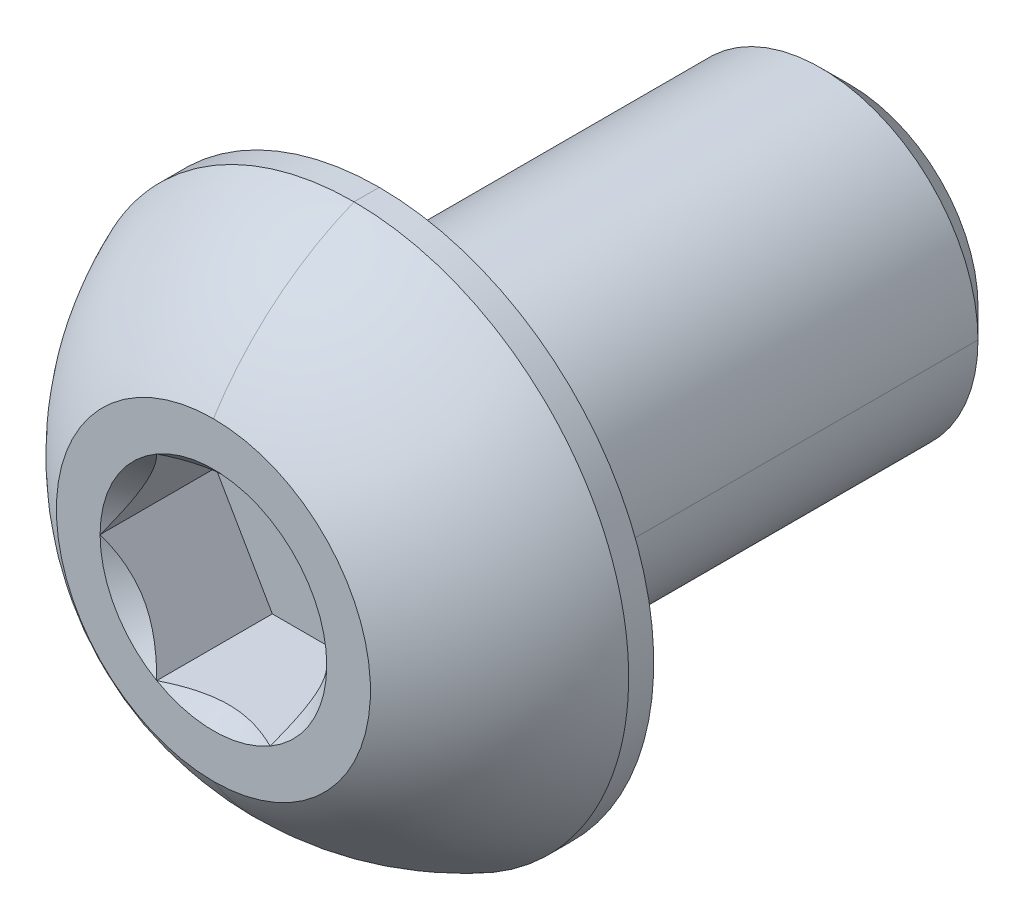
ISO-10303-21;
HEADER;
FILE_DESCRIPTION(('STEP AP214'),'2;1');
FILE_NAME('part.step','',(''),(''),'','','');
FILE_SCHEMA(('AUTOMOTIVE_DESIGN { 1 0 10303 214 1 1 1 1 }'));
ENDSEC;
DATA;
#1=APPLICATION_CONTEXT('core data for automotive mechanical design processes');
#2=APPLICATION_PROTOCOL_DEFINITION('international standard','automotive_design',2000,#1);
#3=PRODUCT_CONTEXT('',#1,'mechanical');
#4=PRODUCT('Part','Part','',(#3));
#5=PRODUCT_RELATED_PRODUCT_CATEGORY('part','',(#4));
#6=PRODUCT_DEFINITION_FORMATION('','',#4);
#7=PRODUCT_DEFINITION_CONTEXT('part definition',#1,'design');
#8=PRODUCT_DEFINITION('design','',#6,#7);
#9=PRODUCT_DEFINITION_SHAPE('','',#8);
#10=(LENGTH_UNIT() NAMED_UNIT(*) SI_UNIT(.MILLI.,.METRE.));
#11=(NAMED_UNIT(*) PLANE_ANGLE_UNIT() SI_UNIT($,.RADIAN.));
#12=(NAMED_UNIT(*) SI_UNIT($,.STERADIAN.) SOLID_ANGLE_UNIT());
#13=UNCERTAINTY_MEASURE_WITH_UNIT(LENGTH_MEASURE(1.E-05),#10,'distance_accuracy_value','');
#14=(GEOMETRIC_REPRESENTATION_CONTEXT(3) GLOBAL_UNCERTAINTY_ASSIGNED_CONTEXT((#13)) GLOBAL_UNIT_ASSIGNED_CONTEXT((#10,
#11,#12)) REPRESENTATION_CONTEXT('',''));
#15=CARTESIAN_POINT('',(0.,0.,0.));
#16=DIRECTION('',(0.,0.,1.));
#17=DIRECTION('',(1.,0.,0.));
#18=AXIS2_PLACEMENT_3D('',#15,#16,#17);
#19=CARTESIAN_POINT('',(1.14567944042316,-1.98437500000003,10.541));
#20=DIRECTION('',(0.866025403784439,-0.5,0.));
#21=DIRECTION('',(0.,0.,-1.));
#22=AXIS2_PLACEMENT_3D('',#19,#20,#21);
#23=PLANE('',#22);
#24=DIRECTION('',(0.,0.,1.));
#25=VECTOR('',#24,1.);
#26=CARTESIAN_POINT('',(1.14567944042316,-1.98437500000003,10.541));
#27=LINE('',#26,#25);
#28=CARTESIAN_POINT('',(1.14567944042316,-1.98437500000003,10.541));
#29=VERTEX_POINT('',#28);
#30=CARTESIAN_POINT('',(1.14567944042305,-1.98437500000003,12.8778));
#31=VERTEX_POINT('',#30);
#32=EDGE_CURVE('E11',#29,#31,#27,.T.);
#33=ORIENTED_EDGE('',*,*,#32,.T.);
#34=CARTESIAN_POINT('',(1.14567944042313,-1.98437500000008,12.8778));
#35=CARTESIAN_POINT('',(1.29042438712971,-1.73366939816544,12.7330550532936));
#36=CARTESIAN_POINT('',(1.42153475258447,-1.50657958379887,12.6578037371241));
#37=CARTESIAN_POINT('',(1.57187260585666,-1.2461867836306,12.571516727782));
#38=CARTESIAN_POINT('',(1.71640935887327,-0.995841783844794,12.5708206054614));
#39=CARTESIAN_POINT('',(1.86068359960209,-0.745951468679066,12.5701257474604));
#40=CARTESIAN_POINT('',(2.01166904881077,-0.484436999446014,12.6556176627032));
#41=CARTESIAN_POINT('',(2.14424389094126,-0.254810637070578,12.7306850100943));
#42=CARTESIAN_POINT('',(2.29135888084634,0.,12.8778));
#43=B_SPLINE_CURVE_WITH_KNOTS('',2,(#34,#35,#36,#37,#38,#39,#40,#41,#42),.UNSPECIFIED.,.F.,.F.,
(3,2,2,2,3),(0.,0.25,0.5,0.75,1.),.UNSPECIFIED.);
#44=CARTESIAN_POINT('',(2.2913588808463,0.,12.8778));
#45=VERTEX_POINT('',#44);
#46=EDGE_CURVE('E244',#31,#45,#43,.T.);
#47=ORIENTED_EDGE('',*,*,#46,.T.);
#48=DIRECTION('',(0.,0.,1.));
#49=VECTOR('',#48,1.);
#50=CARTESIAN_POINT('',(2.29135888084632,0.,10.541));
#51=LINE('',#50,#49);
#52=CARTESIAN_POINT('',(2.29135888084632,0.,10.541));
#53=VERTEX_POINT('',#52);
#54=EDGE_CURVE('E399',#53,#45,#51,.T.);
#55=ORIENTED_EDGE('',*,*,#54,.F.);
#56=DIRECTION('',(0.5,0.866025403784439,0.));
#57=VECTOR('',#56,1.);
#58=CARTESIAN_POINT('',(1.14567944042316,-1.98437500000003,10.541));
#59=LINE('',#58,#57);
#60=EDGE_CURVE('E370',#29,#53,#59,.T.);
#61=ORIENTED_EDGE('',*,*,#60,.F.);
#62=EDGE_LOOP('',(#33,#47,#55,#61));
#63=FACE_BOUND('',#62,.T.);
#64=ADVANCED_FACE('F16',(#63),#23,.F.);
#65=CARTESIAN_POINT('',(-1.14567944042316,-1.98437500000003,10.541));
#66=DIRECTION('',(0.,-1.,0.));
#67=DIRECTION('',(0.,0.,-1.));
#68=AXIS2_PLACEMENT_3D('',#65,#66,#67);
#69=PLANE('',#68);
#70=DIRECTION('',(0.,0.,1.));
#71=VECTOR('',#70,1.);
#72=CARTESIAN_POINT('',(-1.14567944042316,-1.98437500000003,10.541));
#73=LINE('',#72,#71);
#74=CARTESIAN_POINT('',(-1.14567944042316,-1.98437500000003,10.541));
#75=VERTEX_POINT('',#74);
#76=CARTESIAN_POINT('',(-1.14567944042316,-1.98437500000003,12.8778));
#77=VERTEX_POINT('',#76);
#78=EDGE_CURVE('E30',#75,#77,#73,.T.);
#79=ORIENTED_EDGE('',*,*,#78,.T.);
#80=CARTESIAN_POINT('',(-1.14567944042316,-1.98437500000003,12.8778));
#81=CARTESIAN_POINT('',(-0.853920501298432,-1.98437500000003,12.7319205304377));
#82=CARTESIAN_POINT('',(-0.589781630516632,-1.98437500000003,12.6566069367442));
#83=CARTESIAN_POINT('',(-0.289117956224624,-1.98437500000003,12.5708790704251));
#84=CARTESIAN_POINT('',(0.000124911504018098,-1.98437500000003,12.5708161230852));
#85=CARTESIAN_POINT('',(0.288298901652264,-1.98437500000003,12.5707534083629));
#86=CARTESIAN_POINT('',(0.590027301206548,-1.98437500000003,12.6566769406953));
#87=CARTESIAN_POINT('',(0.853481762363533,-1.98437500000003,12.7317011609702));
#88=CARTESIAN_POINT('',(1.14567944042306,-1.98437500000003,12.8778));
#89=B_SPLINE_CURVE_WITH_KNOTS('',2,(#80,#81,#82,#83,#84,#85,#86,#87,#88),.UNSPECIFIED.,.F.,.F.,
(3,2,2,2,3),(0.,0.25,0.5,0.75,1.),.UNSPECIFIED.);
#90=EDGE_CURVE('E463',#77,#31,#89,.T.);
#91=ORIENTED_EDGE('',*,*,#90,.T.);
#92=ORIENTED_EDGE('',*,*,#32,.F.);
#93=DIRECTION('',(1.,0.,0.));
#94=VECTOR('',#93,1.);
#95=CARTESIAN_POINT('',(-1.14567944042316,-1.98437500000003,10.541));
#96=LINE('',#95,#94);
#97=EDGE_CURVE('E359',#75,#29,#96,.T.);
#98=ORIENTED_EDGE('',*,*,#97,.F.);
#99=EDGE_LOOP('',(#79,#91,#92,#98));
#100=FACE_BOUND('',#99,.T.);
#101=ADVANCED_FACE('F213',(#100),#69,.F.);
#102=CARTESIAN_POINT('',(-2.29135888084632,0.,10.541));
#103=DIRECTION('',(-0.866025403784439,-0.5,0.));
#104=DIRECTION('',(-0.5,0.866025403784439,0.));
#105=AXIS2_PLACEMENT_3D('',#102,#103,#104);
#106=PLANE('',#105);
#107=DIRECTION('',(0.,0.,1.));
#108=VECTOR('',#107,1.);
#109=CARTESIAN_POINT('',(-2.29135888084632,0.,10.541));
#110=LINE('',#109,#108);
#111=CARTESIAN_POINT('',(-2.29135888084632,0.,10.541));
#112=VERTEX_POINT('',#111);
#113=CARTESIAN_POINT('',(-2.2913588808463,0.,12.8778));
#114=VERTEX_POINT('',#113);
#115=EDGE_CURVE('E130',#112,#114,#110,.T.);
#116=ORIENTED_EDGE('',*,*,#115,.T.);
#117=CARTESIAN_POINT('',(-2.29135888084634,0.,12.8778));
#118=CARTESIAN_POINT('',(-2.14661393413675,-0.250705601839859,12.7330550532905));
#119=CARTESIAN_POINT('',(-2.01550356868501,-0.477795416201201,12.657803737124));
#120=CARTESIAN_POINT('',(-1.86516571541099,-0.738188216372638,12.5715167277825));
#121=CARTESIAN_POINT('',(-1.72062896239621,-0.988533216155267,12.5708206054614));
#122=CARTESIAN_POINT('',(-1.57635472166922,-1.23842353131785,12.57012574746));
#123=CARTESIAN_POINT('',(-1.42536927245872,-1.49993800055403,12.6556176627032));
#124=CARTESIAN_POINT('',(-1.29279443032937,-1.72956436292749,12.7306850100932));
#125=CARTESIAN_POINT('',(-1.14567944042316,-1.98437500000003,12.8778));
#126=B_SPLINE_CURVE_WITH_KNOTS('',2,(#117,#118,#119,#120,#121,#122,#123,#124,#125),
.UNSPECIFIED.,.F.,.F.,(3,2,2,2,3),(0.,0.25,0.5,0.75,1.),.UNSPECIFIED.);
#127=EDGE_CURVE('E140',#114,#77,#126,.T.);
#128=ORIENTED_EDGE('',*,*,#127,.T.);
#129=ORIENTED_EDGE('',*,*,#78,.F.);
#130=DIRECTION('',(0.5,-0.866025403784439,0.));
#131=VECTOR('',#130,1.);
#132=CARTESIAN_POINT('',(-2.29135888084632,0.,10.541));
#133=LINE('',#132,#131);
#134=EDGE_CURVE('E329',#112,#75,#133,.T.);
#135=ORIENTED_EDGE('',*,*,#134,.F.);
#136=EDGE_LOOP('',(#116,#128,#129,#135));
#137=FACE_BOUND('',#136,.T.);
#138=ADVANCED_FACE('F195',(#137),#106,.F.);
#139=CARTESIAN_POINT('',(-1.14567944042316,1.98437499999997,10.541));
#140=DIRECTION('',(-0.866025403784439,0.5,0.));
#141=DIRECTION('',(0.,0.,1.));
#142=AXIS2_PLACEMENT_3D('',#139,#140,#141);
#143=PLANE('',#142);
#144=DIRECTION('',(0.,0.,1.));
#145=VECTOR('',#144,1.);
#146=CARTESIAN_POINT('',(-1.14567944042316,1.98437499999997,10.541));
#147=LINE('',#146,#145);
#148=CARTESIAN_POINT('',(-1.14567944042316,1.98437499999997,10.541));
#149=VERTEX_POINT('',#148);
#150=CARTESIAN_POINT('',(-1.14567944042316,1.98437499999997,12.8778));
#151=VERTEX_POINT('',#150);
#152=EDGE_CURVE('E117',#149,#151,#147,.T.);
#153=ORIENTED_EDGE('',*,*,#152,.T.);
#154=CARTESIAN_POINT('',(-1.14567944042316,1.98437499999997,12.8778));
#155=CARTESIAN_POINT('',(-1.29042438713266,1.73366939816027,12.7330550532905));
#156=CARTESIAN_POINT('',(-1.42153475258448,1.5065795837988,12.657803737124));
#157=CARTESIAN_POINT('',(-1.5718726058585,1.24618678362736,12.5715167277825));
#158=CARTESIAN_POINT('',(-1.71640935887327,0.995841783844746,12.5708206054614));
#159=CARTESIAN_POINT('',(-1.86068359960212,0.745951468678948,12.5701257474599));
#160=CARTESIAN_POINT('',(-2.01166904881075,0.484436999445988,12.6556176627032));
#161=CARTESIAN_POINT('',(-2.1442438909423,0.254810637068717,12.7306850100953));
#162=CARTESIAN_POINT('',(-2.2913588808463,0.,12.8778));
#163=B_SPLINE_CURVE_WITH_KNOTS('',2,(#154,#155,#156,#157,#158,#159,#160,#161,#162),
.UNSPECIFIED.,.F.,.F.,(3,2,2,2,3),(0.,0.25,0.5,0.75,1.),.UNSPECIFIED.);
#164=EDGE_CURVE('E120',#151,#114,#163,.T.);
#165=ORIENTED_EDGE('',*,*,#164,.T.);
#166=ORIENTED_EDGE('',*,*,#115,.F.);
#167=DIRECTION('',(-0.5,-0.866025403784439,0.));
#168=VECTOR('',#167,1.);
#169=CARTESIAN_POINT('',(-1.14567944042316,1.98437499999997,10.541));
#170=LINE('',#169,#168);
#171=EDGE_CURVE('E124',#149,#112,#170,.T.);
#172=ORIENTED_EDGE('',*,*,#171,.F.);
#173=EDGE_LOOP('',(#153,#165,#166,#172));
#174=FACE_BOUND('',#173,.T.);
#175=ADVANCED_FACE('F119',(#174),#143,.F.);
#176=CARTESIAN_POINT('',(1.14567944042316,1.98437499999997,10.541));
#177=DIRECTION('',(0.,1.,0.));
#178=DIRECTION('',(1.,0.,0.));
#179=AXIS2_PLACEMENT_3D('',#176,#177,#178);
#180=PLANE('',#179);
#181=DIRECTION('',(0.,0.,1.));
#182=VECTOR('',#181,1.);
#183=CARTESIAN_POINT('',(1.14567944042316,1.98437499999997,10.541));
#184=LINE('',#183,#182);
#185=CARTESIAN_POINT('',(1.14567944042316,1.98437499999997,10.541));
#186=VERTEX_POINT('',#185);
#187=CARTESIAN_POINT('',(1.14567944042316,1.98437499999997,12.8778));
#188=VERTEX_POINT('',#187);
#189=EDGE_CURVE('E131',#186,#188,#184,.T.);
#190=ORIENTED_EDGE('',*,*,#189,.T.);
#191=CARTESIAN_POINT('',(1.14567944042316,1.98437499999997,12.8778));
#192=CARTESIAN_POINT('',(0.854053734704096,1.98437499999997,12.7319871471405));
#193=CARTESIAN_POINT('',(0.590027301204522,1.98437499999997,12.6566769406947));
#194=CARTESIAN_POINT('',(0.289359062312149,1.98437499999997,12.5709151219157));
#195=CARTESIAN_POINT('',(0.000124911500085697,1.98437499999997,12.5708161230851));
#196=CARTESIAN_POINT('',(-0.288056722168652,1.98437499999997,12.5707174845093));
#197=CARTESIAN_POINT('',(-0.589781630516823,1.98437499999997,12.6566069367442));
#198=CARTESIAN_POINT('',(-0.853347275065228,1.98437499999997,12.731633917321));
#199=CARTESIAN_POINT('',(-1.14567944042316,1.98437499999997,12.8778));
#200=B_SPLINE_CURVE_WITH_KNOTS('',2,(#191,#192,#193,#194,#195,#196,#197,#198,#199),
.UNSPECIFIED.,.F.,.F.,(3,2,2,2,3),(0.,0.25,0.5,0.75,1.),.UNSPECIFIED.);
#201=EDGE_CURVE('E141',#188,#151,#200,.T.);
#202=ORIENTED_EDGE('',*,*,#201,.T.);
#203=ORIENTED_EDGE('',*,*,#152,.F.);
#204=DIRECTION('',(-1.,0.,0.));
#205=VECTOR('',#204,1.);
#206=CARTESIAN_POINT('',(1.14567944042316,1.98437499999997,10.541));
#207=LINE('',#206,#205);
#208=EDGE_CURVE('E330',#186,#149,#207,.T.);
#209=ORIENTED_EDGE('',*,*,#208,.F.);
#210=EDGE_LOOP('',(#190,#202,#203,#209));
#211=FACE_BOUND('',#210,.T.);
#212=ADVANCED_FACE('F147',(#211),#180,.F.);
#213=CARTESIAN_POINT('',(2.29135888084632,0.,10.541));
#214=DIRECTION('',(0.866025403784438,0.5,0.));
#215=DIRECTION('',(0.,0.,-1.));
#216=AXIS2_PLACEMENT_3D('',#213,#214,#215);
#217=PLANE('',#216);
#218=ORIENTED_EDGE('',*,*,#54,.T.);
#219=CARTESIAN_POINT('',(2.2913588808463,0.,12.8778));
#220=CARTESIAN_POINT('',(2.1466139341399,0.250705601834348,12.7330550532936));
#221=CARTESIAN_POINT('',(2.01550356868498,0.477795416201188,12.657803737124));
#222=CARTESIAN_POINT('',(1.86516571541445,0.73818821636658,12.5715167277829));
#223=CARTESIAN_POINT('',(1.72062896239619,0.988533216155239,12.5708206054614));
#224=CARTESIAN_POINT('',(1.57635472166904,1.23842353131809,12.5701257474595));
#225=CARTESIAN_POINT('',(1.42536927245871,1.49993800055399,12.6556176627032));
#226=CARTESIAN_POINT('',(1.29279443032816,1.72956436292953,12.7306850100943));
#227=CARTESIAN_POINT('',(1.14567944042316,1.98437499999997,12.8778));
#228=B_SPLINE_CURVE_WITH_KNOTS('',2,(#219,#220,#221,#222,#223,#224,#225,#226,#227),
.UNSPECIFIED.,.F.,.F.,(3,2,2,2,3),(0.,0.25,0.5,0.75,1.),.UNSPECIFIED.);
#229=EDGE_CURVE('E153',#45,#188,#228,.T.);
#230=ORIENTED_EDGE('',*,*,#229,.T.);
#231=ORIENTED_EDGE('',*,*,#189,.F.);
#232=DIRECTION('',(-0.5,0.866025403784438,0.));
#233=VECTOR('',#232,1.);
#234=CARTESIAN_POINT('',(2.29135888084632,0.,10.541));
#235=LINE('',#234,#233);
#236=EDGE_CURVE('E374',#53,#186,#235,.T.);
#237=ORIENTED_EDGE('',*,*,#236,.F.);
#238=EDGE_LOOP('',(#218,#230,#231,#237));
#239=FACE_BOUND('',#238,.T.);
#240=ADVANCED_FACE('F394',(#239),#217,.F.);
#241=CARTESIAN_POINT('',(0.,0.,10.541));
#242=DIRECTION('',(0.,0.,1.));
#243=DIRECTION('',(1.,0.,0.));
#244=AXIS2_PLACEMENT_3D('',#241,#242,#243);
#245=PLANE('',#244);
#246=ORIENTED_EDGE('',*,*,#60,.T.);
#247=ORIENTED_EDGE('',*,*,#236,.T.);
#248=ORIENTED_EDGE('',*,*,#208,.T.);
#249=ORIENTED_EDGE('',*,*,#171,.T.);
#250=ORIENTED_EDGE('',*,*,#134,.T.);
#251=ORIENTED_EDGE('',*,*,#97,.T.);
#252=EDGE_LOOP('',(#246,#247,#248,#249,#250,#251));
#253=FACE_BOUND('',#252,.T.);
#254=ADVANCED_FACE('F227',(#253),#245,.T.);
#255=CARTESIAN_POINT('',(0.,0.,12.8778));
#256=DIRECTION('',(0.,0.,1.));
#257=DIRECTION('',(1.,0.,0.));
#258=AXIS2_PLACEMENT_3D('',#255,#256,#257);
#259=CONICAL_SURFACE('',#258,2.2913588808463,0.78539816339745);
#260=CARTESIAN_POINT('',(0.,0.,12.8778));
#261=DIRECTION('',(0.,0.,1.));
#262=DIRECTION('',(1.,0.,0.));
#263=AXIS2_PLACEMENT_3D('',#260,#261,#262);
#264=CIRCLE('',#263,2.2913588808463);
#265=EDGE_CURVE('E369',#31,#45,#264,.T.);
#266=ORIENTED_EDGE('',*,*,#265,.T.);
#267=ORIENTED_EDGE('',*,*,#46,.F.);
#268=EDGE_LOOP('',(#266,#267));
#269=FACE_BOUND('',#268,.T.);
#270=ADVANCED_FACE('F250',(#269),#259,.F.);
#271=CARTESIAN_POINT('',(0.,0.,12.8778));
#272=DIRECTION('',(0.,0.,1.));
#273=DIRECTION('',(1.,0.,0.));
#274=AXIS2_PLACEMENT_3D('',#271,#272,#273);
#275=CONICAL_SURFACE('',#274,2.2913588808463,0.78539816339745);
#276=CARTESIAN_POINT('',(0.,0.,12.8778));
#277=DIRECTION('',(0.,0.,1.));
#278=DIRECTION('',(1.,0.,0.));
#279=AXIS2_PLACEMENT_3D('',#276,#277,#278);
#280=CIRCLE('',#279,2.2913588808463);
#281=EDGE_CURVE('E176',#77,#31,#280,.T.);
#282=ORIENTED_EDGE('',*,*,#281,.T.);
#283=ORIENTED_EDGE('',*,*,#90,.F.);
#284=EDGE_LOOP('',(#282,#283));
#285=FACE_BOUND('',#284,.T.);
#286=ADVANCED_FACE('F224',(#285),#275,.F.);
#287=CARTESIAN_POINT('',(0.,0.,12.8778));
#288=DIRECTION('',(0.,0.,1.));
#289=DIRECTION('',(1.,0.,0.));
#290=AXIS2_PLACEMENT_3D('',#287,#288,#289);
#291=CONICAL_SURFACE('',#290,2.2913588808463,0.78539816339745);
#292=CARTESIAN_POINT('',(0.,0.,12.8778));
#293=DIRECTION('',(0.,0.,1.));
#294=DIRECTION('',(1.,0.,0.));
#295=AXIS2_PLACEMENT_3D('',#292,#293,#294);
#296=CIRCLE('',#295,2.2913588808463);
#297=EDGE_CURVE('E169',#114,#77,#296,.T.);
#298=ORIENTED_EDGE('',*,*,#297,.T.);
#299=ORIENTED_EDGE('',*,*,#127,.F.);
#300=EDGE_LOOP('',(#298,#299));
#301=FACE_BOUND('',#300,.T.);
#302=ADVANCED_FACE('F18',(#301),#291,.F.);
#303=CARTESIAN_POINT('',(0.,0.,12.8778));
#304=DIRECTION('',(0.,0.,1.));
#305=DIRECTION('',(1.,0.,0.));
#306=AXIS2_PLACEMENT_3D('',#303,#304,#305);
#307=CONICAL_SURFACE('',#306,2.2913588808463,0.78539816339745);
#308=CARTESIAN_POINT('',(0.,0.,12.8778));
#309=DIRECTION('',(0.,0.,1.));
#310=DIRECTION('',(1.,0.,0.));
#311=AXIS2_PLACEMENT_3D('',#308,#309,#310);
#312=CIRCLE('',#311,2.2913588808463);
#313=EDGE_CURVE('E137',#151,#114,#312,.T.);
#314=ORIENTED_EDGE('',*,*,#313,.T.);
#315=ORIENTED_EDGE('',*,*,#164,.F.);
#316=EDGE_LOOP('',(#314,#315));
#317=FACE_BOUND('',#316,.T.);
#318=ADVANCED_FACE('F135',(#317),#307,.F.);
#319=CARTESIAN_POINT('',(0.,0.,12.8778));
#320=DIRECTION('',(0.,0.,1.));
#321=DIRECTION('',(1.,0.,0.));
#322=AXIS2_PLACEMENT_3D('',#319,#320,#321);
#323=CONICAL_SURFACE('',#322,2.2913588808463,0.78539816339745);
#324=CARTESIAN_POINT('',(0.,0.,12.8778));
#325=DIRECTION('',(0.,0.,1.));
#326=DIRECTION('',(1.,0.,0.));
#327=AXIS2_PLACEMENT_3D('',#324,#325,#326);
#328=CIRCLE('',#327,2.2913588808463);
#329=EDGE_CURVE('E157',#188,#151,#328,.T.);
#330=ORIENTED_EDGE('',*,*,#329,.T.);
#331=ORIENTED_EDGE('',*,*,#201,.F.);
#332=EDGE_LOOP('',(#330,#331));
#333=FACE_BOUND('',#332,.T.);
#334=ADVANCED_FACE('F158',(#333),#323,.F.);
#335=CARTESIAN_POINT('',(0.,0.,12.8778));
#336=DIRECTION('',(0.,0.,1.));
#337=DIRECTION('',(1.,0.,0.));
#338=AXIS2_PLACEMENT_3D('',#335,#336,#337);
#339=CONICAL_SURFACE('',#338,2.2913588808463,0.78539816339745);
#340=CARTESIAN_POINT('',(0.,0.,12.8778));
#341=DIRECTION('',(0.,0.,1.));
#342=DIRECTION('',(1.,0.,0.));
#343=AXIS2_PLACEMENT_3D('',#340,#341,#342);
#344=CIRCLE('',#343,2.2913588808463);
#345=EDGE_CURVE('E162',#45,#188,#344,.T.);
#346=ORIENTED_EDGE('',*,*,#345,.T.);
#347=ORIENTED_EDGE('',*,*,#229,.F.);
#348=EDGE_LOOP('',(#346,#347));
#349=FACE_BOUND('',#348,.T.);
#350=ADVANCED_FACE('F426',(#349),#339,.F.);
#351=CARTESIAN_POINT('',(0.,0.,12.8778));
#352=DIRECTION('',(0.,0.,1.));
#353=DIRECTION('',(0.,-1.,0.));
#354=AXIS2_PLACEMENT_3D('',#351,#352,#353);
#355=PLANE('',#354);
#356=ORIENTED_EDGE('',*,*,#265,.F.);
#357=ORIENTED_EDGE('',*,*,#281,.F.);
#358=ORIENTED_EDGE('',*,*,#297,.F.);
#359=ORIENTED_EDGE('',*,*,#313,.F.);
#360=ORIENTED_EDGE('',*,*,#329,.F.);
#361=ORIENTED_EDGE('',*,*,#345,.F.);
#362=EDGE_LOOP('',(#356,#357,#358,#359,#360,#361));
#363=FACE_BOUND('',#362,.T.);
#364=CARTESIAN_POINT('',(0.,0.,12.8778));
#365=DIRECTION('',(0.,0.,-1.));
#366=DIRECTION('',(0.,1.,0.));
#367=AXIS2_PLACEMENT_3D('',#364,#365,#366);
#368=CIRCLE('',#367,3.175);
#369=CARTESIAN_POINT('',(0.,3.175,12.8778));
#370=VERTEX_POINT('',#369);
#371=CARTESIAN_POINT('',(0.,-3.175,12.8778));
#372=VERTEX_POINT('',#371);
#373=EDGE_CURVE('E341',#370,#372,#368,.T.);
#374=ORIENTED_EDGE('',*,*,#373,.F.);
#375=CARTESIAN_POINT('',(0.,0.,12.8778));
#376=DIRECTION('',(0.,0.,-1.));
#377=DIRECTION('',(0.,1.,0.));
#378=AXIS2_PLACEMENT_3D('',#375,#376,#377);
#379=CIRCLE('',#378,3.175);
#380=EDGE_CURVE('E366',#372,#370,#379,.T.);
#381=ORIENTED_EDGE('',*,*,#380,.F.);
#382=EDGE_LOOP('',(#374,#381));
#383=FACE_BOUND('',#382,.T.);
#384=ADVANCED_FACE('F165',(#363,#383),#355,.T.);
#385=CARTESIAN_POINT('',(0.,0.,7.81353325892858));
#386=DIRECTION('',(1.,0.,0.));
#387=DIRECTION('',(0.,1.,0.));
#388=AXIS2_PLACEMENT_3D('',#385,#386,#387);
#389=SPHERICAL_SURFACE('',#388,5.97724205840137);
#390=CARTESIAN_POINT('',(0.,0.,7.81353325892858));
#391=DIRECTION('',(1.,0.,0.));
#392=DIRECTION('',(0.,1.,0.));
#393=AXIS2_PLACEMENT_3D('',#390,#391,#392);
#394=CIRCLE('',#393,5.97724205840137);
#395=CARTESIAN_POINT('',(0.,-5.5499,10.033));
#396=VERTEX_POINT('',#395);
#397=EDGE_CURVE('E327',#372,#396,#394,.T.);
#398=ORIENTED_EDGE('',*,*,#397,.F.);
#399=ORIENTED_EDGE('',*,*,#380,.T.);
#400=CARTESIAN_POINT('',(0.,0.,7.81353325892858));
#401=DIRECTION('',(-1.,0.,0.));
#402=DIRECTION('',(0.,0.,1.));
#403=AXIS2_PLACEMENT_3D('',#400,#401,#402);
#404=CIRCLE('',#403,5.97724205840137);
#405=CARTESIAN_POINT('',(0.,5.5499,10.033));
#406=VERTEX_POINT('',#405);
#407=EDGE_CURVE('E322',#370,#406,#404,.T.);
#408=ORIENTED_EDGE('',*,*,#407,.T.);
#409=CARTESIAN_POINT('',(0.,0.,10.033));
#410=DIRECTION('',(0.,0.,-1.));
#411=DIRECTION('',(0.,1.,0.));
#412=AXIS2_PLACEMENT_3D('',#409,#410,#411);
#413=CIRCLE('',#412,5.5499);
#414=EDGE_CURVE('E317',#396,#406,#413,.T.);
#415=ORIENTED_EDGE('',*,*,#414,.F.);
#416=EDGE_LOOP('',(#398,#399,#408,#415));
#417=FACE_BOUND('',#416,.T.);
#418=ADVANCED_FACE('F203',(#417),#389,.T.);
#419=CARTESIAN_POINT('',(0.,0.,9.525));
#420=DIRECTION('',(0.,0.,-1.));
#421=DIRECTION('',(0.,1.,0.));
#422=AXIS2_PLACEMENT_3D('',#419,#420,#421);
#423=CYLINDRICAL_SURFACE('',#422,5.5499);
#424=DIRECTION('',(0.,0.,-1.));
#425=VECTOR('',#424,1.);
#426=CARTESIAN_POINT('',(0.,-5.5499,9.525));
#427=LINE('',#426,#425);
#428=CARTESIAN_POINT('',(0.,-5.5499,9.525));
#429=VERTEX_POINT('',#428);
#430=EDGE_CURVE('E318',#396,#429,#427,.T.);
#431=ORIENTED_EDGE('',*,*,#430,.F.);
#432=ORIENTED_EDGE('',*,*,#414,.T.);
#433=DIRECTION('',(0.,0.,-1.));
#434=VECTOR('',#433,1.);
#435=CARTESIAN_POINT('',(0.,5.5499,9.525));
#436=LINE('',#435,#434);
#437=CARTESIAN_POINT('',(0.,5.5499,9.525));
#438=VERTEX_POINT('',#437);
#439=EDGE_CURVE('E296',#406,#438,#436,.T.);
#440=ORIENTED_EDGE('',*,*,#439,.T.);
#441=CARTESIAN_POINT('',(0.,0.,9.525));
#442=DIRECTION('',(0.,0.,-1.));
#443=DIRECTION('',(0.,1.,0.));
#444=AXIS2_PLACEMENT_3D('',#441,#442,#443);
#445=CIRCLE('',#444,5.5499);
#446=EDGE_CURVE('E314',#429,#438,#445,.T.);
#447=ORIENTED_EDGE('',*,*,#446,.F.);
#448=EDGE_LOOP('',(#431,#432,#440,#447));
#449=FACE_BOUND('',#448,.T.);
#450=ADVANCED_FACE('F200',(#449),#423,.T.);
#451=CARTESIAN_POINT('',(0.,5.5499,9.525));
#452=DIRECTION('',(0.,0.,-1.));
#453=DIRECTION('',(-1.,0.,0.));
#454=AXIS2_PLACEMENT_3D('',#451,#452,#453);
#455=PLANE('',#454);
#456=CARTESIAN_POINT('',(0.,0.,9.525));
#457=DIRECTION('',(0.,0.,1.));
#458=DIRECTION('',(1.,0.,0.));
#459=AXIS2_PLACEMENT_3D('',#456,#457,#458);
#460=CIRCLE('',#459,3.175);
#461=CARTESIAN_POINT('',(-3.175,0.,9.525));
#462=VERTEX_POINT('',#461);
#463=CARTESIAN_POINT('',(3.175,0.,9.525));
#464=VERTEX_POINT('',#463);
#465=EDGE_CURVE('E378',#462,#464,#460,.T.);
#466=ORIENTED_EDGE('',*,*,#465,.T.);
#467=CARTESIAN_POINT('',(0.,0.,9.525));
#468=DIRECTION('',(0.,0.,1.));
#469=DIRECTION('',(1.,0.,0.));
#470=AXIS2_PLACEMENT_3D('',#467,#468,#469);
#471=CIRCLE('',#470,3.175);
#472=EDGE_CURVE('E334',#464,#462,#471,.T.);
#473=ORIENTED_EDGE('',*,*,#472,.T.);
#474=EDGE_LOOP('',(#466,#473));
#475=FACE_BOUND('',#474,.T.);
#476=CARTESIAN_POINT('',(0.,0.,9.525));
#477=DIRECTION('',(0.,0.,-1.));
#478=DIRECTION('',(0.,1.,0.));
#479=AXIS2_PLACEMENT_3D('',#476,#477,#478);
#480=CIRCLE('',#479,5.5499);
#481=EDGE_CURVE('E305',#438,#429,#480,.T.);
#482=ORIENTED_EDGE('',*,*,#481,.T.);
#483=ORIENTED_EDGE('',*,*,#446,.T.);
#484=EDGE_LOOP('',(#482,#483));
#485=FACE_BOUND('',#484,.T.);
#486=ADVANCED_FACE('F197',(#475,#485),#455,.T.);
#487=CARTESIAN_POINT('',(0.,0.,0.594360000000009));
#488=DIRECTION('',(0.,0.,1.));
#489=DIRECTION('',(1.,0.,0.));
#490=AXIS2_PLACEMENT_3D('',#487,#488,#489);
#491=CONICAL_SURFACE('',#490,3.175,0.785398163397449);
#492=DIRECTION('',(-0.707106781186549,0.,0.707106781186547));
#493=VECTOR('',#492,1.);
#494=CARTESIAN_POINT('',(-3.175,0.,0.594360000000009));
#495=LINE('',#494,#493);
#496=CARTESIAN_POINT('',(-2.58064,0.,0.));
#497=VERTEX_POINT('',#496);
#498=CARTESIAN_POINT('',(-3.175,0.,0.594360000000009));
#499=VERTEX_POINT('',#498);
#500=EDGE_CURVE('E288',#497,#499,#495,.T.);
#501=ORIENTED_EDGE('',*,*,#500,.F.);
#502=CARTESIAN_POINT('',(0.,0.,0.));
#503=DIRECTION('',(0.,0.,-1.));
#504=DIRECTION('',(1.,0.,0.));
#505=AXIS2_PLACEMENT_3D('',#502,#503,#504);
#506=CIRCLE('',#505,2.58064);
#507=CARTESIAN_POINT('',(2.58064,0.,0.));
#508=VERTEX_POINT('',#507);
#509=EDGE_CURVE('E311',#508,#497,#506,.T.);
#510=ORIENTED_EDGE('',*,*,#509,.F.);
#511=DIRECTION('',(0.707106781186549,0.,0.707106781186547));
#512=VECTOR('',#511,1.);
#513=CARTESIAN_POINT('',(3.175,0.,0.594360000000009));
#514=LINE('',#513,#512);
#515=CARTESIAN_POINT('',(3.175,0.,0.594360000000009));
#516=VERTEX_POINT('',#515);
#517=EDGE_CURVE('E291',#508,#516,#514,.T.);
#518=ORIENTED_EDGE('',*,*,#517,.T.);
#519=CARTESIAN_POINT('',(0.,0.,0.594360000000009));
#520=DIRECTION('',(0.,0.,1.));
#521=DIRECTION('',(1.,0.,0.));
#522=AXIS2_PLACEMENT_3D('',#519,#520,#521);
#523=CIRCLE('',#522,3.175);
#524=EDGE_CURVE('E309',#499,#516,#523,.T.);
#525=ORIENTED_EDGE('',*,*,#524,.F.);
#526=EDGE_LOOP('',(#501,#510,#518,#525));
#527=FACE_BOUND('',#526,.T.);
#528=ADVANCED_FACE('F199',(#527),#491,.T.);
#529=CARTESIAN_POINT('',(0.,0.,0.));
#530=DIRECTION('',(0.,0.,1.));
#531=DIRECTION('',(1.,0.,0.));
#532=AXIS2_PLACEMENT_3D('',#529,#530,#531);
#533=PLANE('',#532);
#534=ORIENTED_EDGE('',*,*,#509,.T.);
#535=CARTESIAN_POINT('',(0.,0.,0.));
#536=DIRECTION('',(0.,0.,-1.));
#537=DIRECTION('',(1.,0.,0.));
#538=AXIS2_PLACEMENT_3D('',#535,#536,#537);
#539=CIRCLE('',#538,2.58064);
#540=EDGE_CURVE('E285',#497,#508,#539,.T.);
#541=ORIENTED_EDGE('',*,*,#540,.T.);
#542=EDGE_LOOP('',(#534,#541));
#543=FACE_BOUND('',#542,.T.);
#544=ADVANCED_FACE('F267',(#543),#533,.F.);
#545=CARTESIAN_POINT('',(0.,0.,9.525));
#546=DIRECTION('',(0.,0.,-1.));
#547=DIRECTION('',(-1.,0.,0.));
#548=AXIS2_PLACEMENT_3D('',#545,#546,#547);
#549=CYLINDRICAL_SURFACE('',#548,3.175);
#550=DIRECTION('',(0.,0.,-1.));
#551=VECTOR('',#550,1.);
#552=CARTESIAN_POINT('',(3.175,0.,9.525));
#553=LINE('',#552,#551);
#554=EDGE_CURVE('E335',#464,#516,#553,.T.);
#555=ORIENTED_EDGE('',*,*,#554,.F.);
#556=ORIENTED_EDGE('',*,*,#465,.F.);
#557=DIRECTION('',(0.,0.,-1.));
#558=VECTOR('',#557,1.);
#559=CARTESIAN_POINT('',(-3.175,0.,9.525));
#560=LINE('',#559,#558);
#561=EDGE_CURVE('E338',#462,#499,#560,.T.);
#562=ORIENTED_EDGE('',*,*,#561,.T.);
#563=ORIENTED_EDGE('',*,*,#524,.T.);
#564=EDGE_LOOP('',(#555,#556,#562,#563));
#565=FACE_BOUND('',#564,.T.);
#566=ADVANCED_FACE('F259',(#565),#549,.T.);
#567=CARTESIAN_POINT('',(0.,0.,9.525));
#568=DIRECTION('',(0.,0.,-1.));
#569=DIRECTION('',(-1.,0.,0.));
#570=AXIS2_PLACEMENT_3D('',#567,#568,#569);
#571=CYLINDRICAL_SURFACE('',#570,3.175);
#572=ORIENTED_EDGE('',*,*,#472,.F.);
#573=ORIENTED_EDGE('',*,*,#554,.T.);
#574=CARTESIAN_POINT('',(0.,0.,0.594360000000009));
#575=DIRECTION('',(0.,0.,1.));
#576=DIRECTION('',(1.,0.,0.));
#577=AXIS2_PLACEMENT_3D('',#574,#575,#576);
#578=CIRCLE('',#577,3.175);
#579=EDGE_CURVE('E302',#516,#499,#578,.T.);
#580=ORIENTED_EDGE('',*,*,#579,.T.);
#581=ORIENTED_EDGE('',*,*,#561,.F.);
#582=EDGE_LOOP('',(#572,#573,#580,#581));
#583=FACE_BOUND('',#582,.T.);
#584=ADVANCED_FACE('F272',(#583),#571,.T.);
#585=CARTESIAN_POINT('',(0.,0.,0.594360000000009));
#586=DIRECTION('',(0.,0.,1.));
#587=DIRECTION('',(1.,0.,0.));
#588=AXIS2_PLACEMENT_3D('',#585,#586,#587);
#589=CONICAL_SURFACE('',#588,3.175,0.785398163397449);
#590=ORIENTED_EDGE('',*,*,#540,.F.);
#591=ORIENTED_EDGE('',*,*,#500,.T.);
#592=ORIENTED_EDGE('',*,*,#579,.F.);
#593=ORIENTED_EDGE('',*,*,#517,.F.);
#594=EDGE_LOOP('',(#590,#591,#592,#593));
#595=FACE_BOUND('',#594,.T.);
#596=ADVANCED_FACE('F270',(#595),#589,.T.);
#597=CARTESIAN_POINT('',(0.,0.,9.525));
#598=DIRECTION('',(0.,0.,-1.));
#599=DIRECTION('',(0.,1.,0.));
#600=AXIS2_PLACEMENT_3D('',#597,#598,#599);
#601=CYLINDRICAL_SURFACE('',#600,5.5499);
#602=CARTESIAN_POINT('',(0.,0.,10.033));
#603=DIRECTION('',(0.,0.,-1.));
#604=DIRECTION('',(0.,1.,0.));
#605=AXIS2_PLACEMENT_3D('',#602,#603,#604);
#606=CIRCLE('',#605,5.5499);
#607=EDGE_CURVE('E323',#406,#396,#606,.T.);
#608=ORIENTED_EDGE('',*,*,#607,.T.);
#609=ORIENTED_EDGE('',*,*,#430,.T.);
#610=ORIENTED_EDGE('',*,*,#481,.F.);
#611=ORIENTED_EDGE('',*,*,#439,.F.);
#612=EDGE_LOOP('',(#608,#609,#610,#611));
#613=FACE_BOUND('',#612,.T.);
#614=ADVANCED_FACE('F265',(#613),#601,.T.);
#615=CARTESIAN_POINT('',(0.,0.,7.81353325892858));
#616=DIRECTION('',(1.,0.,0.));
#617=DIRECTION('',(0.,1.,0.));
#618=AXIS2_PLACEMENT_3D('',#615,#616,#617);
#619=SPHERICAL_SURFACE('',#618,5.97724205840137);
#620=ORIENTED_EDGE('',*,*,#373,.T.);
#621=ORIENTED_EDGE('',*,*,#397,.T.);
#622=ORIENTED_EDGE('',*,*,#607,.F.);
#623=ORIENTED_EDGE('',*,*,#407,.F.);
#624=EDGE_LOOP('',(#620,#621,#622,#623));
#625=FACE_BOUND('',#624,.T.);
#626=ADVANCED_FACE('F262',(#625),#619,.T.);
#627=CLOSED_SHELL('',(#64,#101,#138,#175,#212,#240,#254,#270,#286,#302,#318,#334,#350,#384,#418,
#450,#486,#528,#544,#566,#584,#596,#614,#626));
#628=MANIFOLD_SOLID_BREP('B1',#627);
#629=ADVANCED_BREP_SHAPE_REPRESENTATION('',(#18,#628),#14);
#630=SHAPE_DEFINITION_REPRESENTATION(#9,#629);
ENDSEC;
END-ISO-10303-21;
